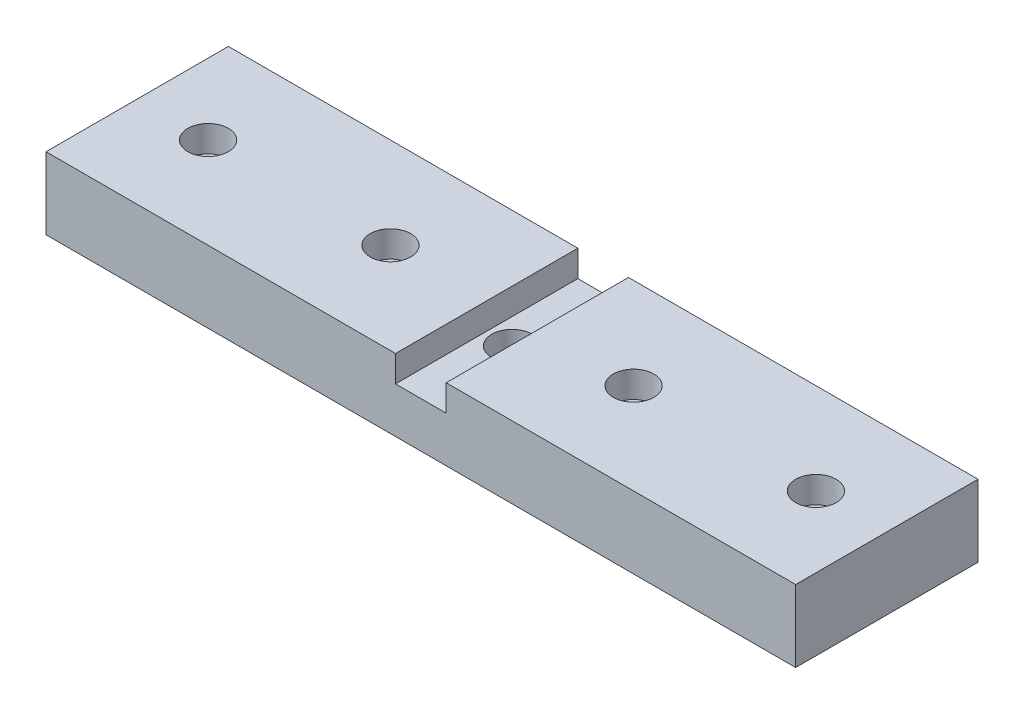
ISO-10303-21;
HEADER;
FILE_DESCRIPTION(('STEP AP214'),'2;1');
FILE_NAME('part.step','',(''),(''),'','','');
FILE_SCHEMA(('AUTOMOTIVE_DESIGN { 1 0 10303 214 1 1 1 1 }'));
ENDSEC;
DATA;
#1=APPLICATION_CONTEXT('core data for automotive mechanical design processes');
#2=APPLICATION_PROTOCOL_DEFINITION('international standard','automotive_design',2000,#1);
#3=PRODUCT_CONTEXT('',#1,'mechanical');
#4=PRODUCT('Part','Part','',(#3));
#5=PRODUCT_RELATED_PRODUCT_CATEGORY('part','',(#4));
#6=PRODUCT_DEFINITION_FORMATION('','',#4);
#7=PRODUCT_DEFINITION_CONTEXT('part definition',#1,'design');
#8=PRODUCT_DEFINITION('design','',#6,#7);
#9=PRODUCT_DEFINITION_SHAPE('','',#8);
#10=(LENGTH_UNIT() NAMED_UNIT(*) SI_UNIT(.MILLI.,.METRE.));
#11=(NAMED_UNIT(*) PLANE_ANGLE_UNIT() SI_UNIT($,.RADIAN.));
#12=(NAMED_UNIT(*) SI_UNIT($,.STERADIAN.) SOLID_ANGLE_UNIT());
#13=UNCERTAINTY_MEASURE_WITH_UNIT(LENGTH_MEASURE(1.E-05),#10,'distance_accuracy_value','');
#14=(GEOMETRIC_REPRESENTATION_CONTEXT(3) GLOBAL_UNCERTAINTY_ASSIGNED_CONTEXT((#13)) GLOBAL_UNIT_ASSIGNED_CONTEXT((#10,
#11,#12)) REPRESENTATION_CONTEXT('',''));
#15=CARTESIAN_POINT('',(0.,0.,0.));
#16=DIRECTION('',(0.,0.,1.));
#17=DIRECTION('',(1.,0.,0.));
#18=AXIS2_PLACEMENT_3D('',#15,#16,#17);
#19=CARTESIAN_POINT('',(150.,35.5,0.));
#20=DIRECTION('',(0.,1.,0.));
#21=DIRECTION('',(0.,0.,1.));
#22=AXIS2_PLACEMENT_3D('',#19,#20,#21);
#23=CYLINDRICAL_SURFACE('',#22,6.74999999999999);
#24=CARTESIAN_POINT('',(150.,0.,0.));
#25=DIRECTION('',(0.,1.,0.));
#26=DIRECTION('',(0.,0.,1.));
#27=AXIS2_PLACEMENT_3D('',#24,#25,#26);
#28=CIRCLE('',#27,6.74999999999998);
#29=CARTESIAN_POINT('',(150.,0.,6.74999999999993));
#30=VERTEX_POINT('',#29);
#31=EDGE_CURVE('E11',#30,#30,#28,.T.);
#32=ORIENTED_EDGE('',*,*,#31,.F.);
#33=EDGE_LOOP('',(#32));
#34=FACE_BOUND('',#33,.T.);
#35=CARTESIAN_POINT('',(150.,22.5,0.));
#36=DIRECTION('',(0.,1.,0.));
#37=DIRECTION('',(0.,0.,1.));
#38=AXIS2_PLACEMENT_3D('',#35,#36,#37);
#39=CIRCLE('',#38,6.75000000000001);
#40=CARTESIAN_POINT('',(150.,22.5,6.74999999999996));
#41=VERTEX_POINT('',#40);
#42=EDGE_CURVE('E42',#41,#41,#39,.T.);
#43=ORIENTED_EDGE('',*,*,#42,.T.);
#44=EDGE_LOOP('',(#43));
#45=FACE_BOUND('',#44,.T.);
#46=ADVANCED_FACE('F35',(#34,#45),#23,.F.);
#47=CARTESIAN_POINT('',(156.75,22.5,0.));
#48=DIRECTION('',(0.,-1.,0.));
#49=DIRECTION('',(0.,0.,-1.));
#50=AXIS2_PLACEMENT_3D('',#47,#48,#49);
#51=PLANE('',#50);
#52=ORIENTED_EDGE('',*,*,#42,.F.);
#53=EDGE_LOOP('',(#52));
#54=FACE_BOUND('',#53,.T.);
#55=CARTESIAN_POINT('',(150.,22.5,0.));
#56=DIRECTION('',(0.,1.,0.));
#57=DIRECTION('',(0.,0.,1.));
#58=AXIS2_PLACEMENT_3D('',#55,#56,#57);
#59=CIRCLE('',#58,9.99999999999998);
#60=CARTESIAN_POINT('',(150.,22.5,9.99999999999994));
#61=VERTEX_POINT('',#60);
#62=EDGE_CURVE('E171',#61,#61,#59,.T.);
#63=ORIENTED_EDGE('',*,*,#62,.T.);
#64=EDGE_LOOP('',(#63));
#65=FACE_BOUND('',#64,.T.);
#66=ADVANCED_FACE('F180',(#54,#65),#51,.F.);
#67=CARTESIAN_POINT('',(150.,35.5,0.));
#68=DIRECTION('',(0.,1.,0.));
#69=DIRECTION('',(0.,0.,1.));
#70=AXIS2_PLACEMENT_3D('',#67,#68,#69);
#71=CYLINDRICAL_SURFACE('',#70,9.99999999999999);
#72=ORIENTED_EDGE('',*,*,#62,.F.);
#73=EDGE_LOOP('',(#72));
#74=FACE_BOUND('',#73,.T.);
#75=CARTESIAN_POINT('',(150.,35.5,0.));
#76=DIRECTION('',(0.,1.,0.));
#77=DIRECTION('',(0.,0.,1.));
#78=AXIS2_PLACEMENT_3D('',#75,#76,#77);
#79=CIRCLE('',#78,10.);
#80=CARTESIAN_POINT('',(150.,35.5,9.99999999999996));
#81=VERTEX_POINT('',#80);
#82=EDGE_CURVE('E174',#81,#81,#79,.T.);
#83=ORIENTED_EDGE('',*,*,#82,.T.);
#84=EDGE_LOOP('',(#83));
#85=FACE_BOUND('',#84,.T.);
#86=ADVANCED_FACE('F183',(#74,#85),#71,.F.);
#87=CARTESIAN_POINT('',(60.,35.5,0.));
#88=DIRECTION('',(0.,1.,0.));
#89=DIRECTION('',(0.,0.,1.));
#90=AXIS2_PLACEMENT_3D('',#87,#88,#89);
#91=CYLINDRICAL_SURFACE('',#90,6.74999999999999);
#92=CARTESIAN_POINT('',(60.,0.,0.));
#93=DIRECTION('',(0.,1.,0.));
#94=DIRECTION('',(0.,0.,1.));
#95=AXIS2_PLACEMENT_3D('',#92,#93,#94);
#96=CIRCLE('',#95,6.74999999999998);
#97=CARTESIAN_POINT('',(60.,0.,6.74999999999994));
#98=VERTEX_POINT('',#97);
#99=EDGE_CURVE('E168',#98,#98,#96,.T.);
#100=ORIENTED_EDGE('',*,*,#99,.F.);
#101=EDGE_LOOP('',(#100));
#102=FACE_BOUND('',#101,.T.);
#103=CARTESIAN_POINT('',(60.,22.5,0.));
#104=DIRECTION('',(0.,1.,0.));
#105=DIRECTION('',(0.,0.,1.));
#106=AXIS2_PLACEMENT_3D('',#103,#104,#105);
#107=CIRCLE('',#106,6.75000000000001);
#108=CARTESIAN_POINT('',(60.,22.5,6.74999999999997));
#109=VERTEX_POINT('',#108);
#110=EDGE_CURVE('E165',#109,#109,#107,.T.);
#111=ORIENTED_EDGE('',*,*,#110,.T.);
#112=EDGE_LOOP('',(#111));
#113=FACE_BOUND('',#112,.T.);
#114=ADVANCED_FACE('F188',(#102,#113),#91,.F.);
#115=CARTESIAN_POINT('',(66.75,22.5,0.));
#116=DIRECTION('',(0.,-1.,0.));
#117=DIRECTION('',(0.,0.,-1.));
#118=AXIS2_PLACEMENT_3D('',#115,#116,#117);
#119=PLANE('',#118);
#120=ORIENTED_EDGE('',*,*,#110,.F.);
#121=EDGE_LOOP('',(#120));
#122=FACE_BOUND('',#121,.T.);
#123=CARTESIAN_POINT('',(60.,22.5,0.));
#124=DIRECTION('',(0.,1.,0.));
#125=DIRECTION('',(0.,0.,1.));
#126=AXIS2_PLACEMENT_3D('',#123,#124,#125);
#127=CIRCLE('',#126,9.99999999999998);
#128=CARTESIAN_POINT('',(60.,22.5,9.99999999999995));
#129=VERTEX_POINT('',#128);
#130=EDGE_CURVE('E159',#129,#129,#127,.T.);
#131=ORIENTED_EDGE('',*,*,#130,.T.);
#132=EDGE_LOOP('',(#131));
#133=FACE_BOUND('',#132,.T.);
#134=ADVANCED_FACE('F308',(#122,#133),#119,.F.);
#135=CARTESIAN_POINT('',(60.,35.5,0.));
#136=DIRECTION('',(0.,1.,0.));
#137=DIRECTION('',(0.,0.,1.));
#138=AXIS2_PLACEMENT_3D('',#135,#136,#137);
#139=CYLINDRICAL_SURFACE('',#138,9.99999999999999);
#140=ORIENTED_EDGE('',*,*,#130,.F.);
#141=EDGE_LOOP('',(#140));
#142=FACE_BOUND('',#141,.T.);
#143=CARTESIAN_POINT('',(60.,35.5,0.));
#144=DIRECTION('',(0.,1.,0.));
#145=DIRECTION('',(0.,0.,1.));
#146=AXIS2_PLACEMENT_3D('',#143,#144,#145);
#147=CIRCLE('',#146,10.);
#148=CARTESIAN_POINT('',(60.,35.5,9.99999999999998));
#149=VERTEX_POINT('',#148);
#150=EDGE_CURVE('E162',#149,#149,#147,.T.);
#151=ORIENTED_EDGE('',*,*,#150,.T.);
#152=EDGE_LOOP('',(#151));
#153=FACE_BOUND('',#152,.T.);
#154=ADVANCED_FACE('F196',(#142,#153),#139,.F.);
#155=CARTESIAN_POINT('',(0.,35.5,0.));
#156=DIRECTION('',(0.,1.,0.));
#157=DIRECTION('',(0.,0.,1.));
#158=AXIS2_PLACEMENT_3D('',#155,#156,#157);
#159=PLANE('',#158);
#160=ORIENTED_EDGE('',*,*,#82,.F.);
#161=EDGE_LOOP('',(#160));
#162=FACE_BOUND('',#161,.T.);
#163=ORIENTED_EDGE('',*,*,#150,.F.);
#164=EDGE_LOOP('',(#163));
#165=FACE_BOUND('',#164,.T.);
#166=DIRECTION('',(0.,0.,-1.));
#167=VECTOR('',#166,1.);
#168=CARTESIAN_POINT('',(12.5,35.5,45.));
#169=LINE('',#168,#167);
#170=CARTESIAN_POINT('',(12.5,35.5,45.));
#171=VERTEX_POINT('',#170);
#172=CARTESIAN_POINT('',(12.5,35.5,-45.));
#173=VERTEX_POINT('',#172);
#174=EDGE_CURVE('E123',#171,#173,#169,.T.);
#175=ORIENTED_EDGE('',*,*,#174,.F.);
#176=DIRECTION('',(1.,0.,0.));
#177=VECTOR('',#176,1.);
#178=CARTESIAN_POINT('',(185.,35.5,45.));
#179=LINE('',#178,#177);
#180=CARTESIAN_POINT('',(185.,35.5,45.));
#181=VERTEX_POINT('',#180);
#182=EDGE_CURVE('E134',#171,#181,#179,.T.);
#183=ORIENTED_EDGE('',*,*,#182,.T.);
#184=DIRECTION('',(0.,0.,-1.));
#185=VECTOR('',#184,1.);
#186=CARTESIAN_POINT('',(185.,35.5,45.));
#187=LINE('',#186,#185);
#188=CARTESIAN_POINT('',(185.,35.5,-45.));
#189=VERTEX_POINT('',#188);
#190=EDGE_CURVE('E136',#181,#189,#187,.T.);
#191=ORIENTED_EDGE('',*,*,#190,.T.);
#192=DIRECTION('',(-1.,0.,0.));
#193=VECTOR('',#192,1.);
#194=CARTESIAN_POINT('',(185.,35.5,-45.));
#195=LINE('',#194,#193);
#196=EDGE_CURVE('E138',#189,#173,#195,.T.);
#197=ORIENTED_EDGE('',*,*,#196,.T.);
#198=EDGE_LOOP('',(#175,#183,#191,#197));
#199=FACE_BOUND('',#198,.T.);
#200=ADVANCED_FACE('F192',(#162,#165,#199),#159,.T.);
#201=CARTESIAN_POINT('',(-185.,35.5,45.));
#202=DIRECTION('',(1.,0.,0.));
#203=DIRECTION('',(0.,0.,-1.));
#204=AXIS2_PLACEMENT_3D('',#201,#202,#203);
#205=PLANE('',#204);
#206=DIRECTION('',(0.,0.,1.));
#207=VECTOR('',#206,1.);
#208=CARTESIAN_POINT('',(-185.,0.,45.));
#209=LINE('',#208,#207);
#210=CARTESIAN_POINT('',(-185.,0.,-45.));
#211=VERTEX_POINT('',#210);
#212=CARTESIAN_POINT('',(-185.,0.,45.));
#213=VERTEX_POINT('',#212);
#214=EDGE_CURVE('E142',#211,#213,#209,.T.);
#215=ORIENTED_EDGE('',*,*,#214,.T.);
#216=DIRECTION('',(0.,-1.,0.));
#217=VECTOR('',#216,1.);
#218=CARTESIAN_POINT('',(-185.,35.5,45.));
#219=LINE('',#218,#217);
#220=CARTESIAN_POINT('',(-185.,35.5,45.));
#221=VERTEX_POINT('',#220);
#222=EDGE_CURVE('E157',#221,#213,#219,.T.);
#223=ORIENTED_EDGE('',*,*,#222,.F.);
#224=DIRECTION('',(0.,0.,1.));
#225=VECTOR('',#224,1.);
#226=CARTESIAN_POINT('',(-185.,35.5,45.));
#227=LINE('',#226,#225);
#228=CARTESIAN_POINT('',(-185.,35.5,-45.));
#229=VERTEX_POINT('',#228);
#230=EDGE_CURVE('E132',#229,#221,#227,.T.);
#231=ORIENTED_EDGE('',*,*,#230,.F.);
#232=DIRECTION('',(0.,-1.,0.));
#233=VECTOR('',#232,1.);
#234=CARTESIAN_POINT('',(-185.,35.5,-45.));
#235=LINE('',#234,#233);
#236=EDGE_CURVE('E141',#229,#211,#235,.T.);
#237=ORIENTED_EDGE('',*,*,#236,.T.);
#238=EDGE_LOOP('',(#215,#223,#231,#237));
#239=FACE_BOUND('',#238,.T.);
#240=ADVANCED_FACE('F195',(#239),#205,.F.);
#241=CARTESIAN_POINT('',(185.,35.5,45.));
#242=DIRECTION('',(0.,0.,-1.));
#243=DIRECTION('',(-1.,0.,0.));
#244=AXIS2_PLACEMENT_3D('',#241,#242,#243);
#245=PLANE('',#244);
#246=ORIENTED_EDGE('',*,*,#182,.F.);
#247=DIRECTION('',(0.,1.,0.));
#248=VECTOR('',#247,1.);
#249=CARTESIAN_POINT('',(12.5,22.5,45.));
#250=LINE('',#249,#248);
#251=CARTESIAN_POINT('',(12.5,22.5,45.));
#252=VERTEX_POINT('',#251);
#253=EDGE_CURVE('E127',#252,#171,#250,.T.);
#254=ORIENTED_EDGE('',*,*,#253,.F.);
#255=DIRECTION('',(1.,0.,0.));
#256=VECTOR('',#255,1.);
#257=CARTESIAN_POINT('',(12.5,22.5,45.));
#258=LINE('',#257,#256);
#259=CARTESIAN_POINT('',(-12.5,22.5,45.));
#260=VERTEX_POINT('',#259);
#261=EDGE_CURVE('E114',#260,#252,#258,.T.);
#262=ORIENTED_EDGE('',*,*,#261,.F.);
#263=DIRECTION('',(0.,1.,0.));
#264=VECTOR('',#263,1.);
#265=CARTESIAN_POINT('',(-12.5,22.5,45.));
#266=LINE('',#265,#264);
#267=CARTESIAN_POINT('',(-12.5,35.5,45.));
#268=VERTEX_POINT('',#267);
#269=EDGE_CURVE('E111',#260,#268,#266,.T.);
#270=ORIENTED_EDGE('',*,*,#269,.T.);
#271=EDGE_CURVE('E87',#221,#268,#179,.T.);
#272=ORIENTED_EDGE('',*,*,#271,.F.);
#273=ORIENTED_EDGE('',*,*,#222,.T.);
#274=DIRECTION('',(1.,0.,0.));
#275=VECTOR('',#274,1.);
#276=CARTESIAN_POINT('',(185.,0.,45.));
#277=LINE('',#276,#275);
#278=CARTESIAN_POINT('',(185.,0.,45.));
#279=VERTEX_POINT('',#278);
#280=EDGE_CURVE('E145',#213,#279,#277,.T.);
#281=ORIENTED_EDGE('',*,*,#280,.T.);
#282=DIRECTION('',(0.,-1.,0.));
#283=VECTOR('',#282,1.);
#284=CARTESIAN_POINT('',(185.,35.5,45.));
#285=LINE('',#284,#283);
#286=EDGE_CURVE('E154',#181,#279,#285,.T.);
#287=ORIENTED_EDGE('',*,*,#286,.F.);
#288=EDGE_LOOP('',(#246,#254,#262,#270,#272,#273,#281,#287));
#289=FACE_BOUND('',#288,.T.);
#290=ADVANCED_FACE('F209',(#289),#245,.F.);
#291=CARTESIAN_POINT('',(185.,35.5,45.));
#292=DIRECTION('',(-1.,0.,0.));
#293=DIRECTION('',(0.,0.,1.));
#294=AXIS2_PLACEMENT_3D('',#291,#292,#293);
#295=PLANE('',#294);
#296=DIRECTION('',(0.,0.,-1.));
#297=VECTOR('',#296,1.);
#298=CARTESIAN_POINT('',(185.,0.,45.));
#299=LINE('',#298,#297);
#300=CARTESIAN_POINT('',(185.,0.,-45.));
#301=VERTEX_POINT('',#300);
#302=EDGE_CURVE('E148',#279,#301,#299,.T.);
#303=ORIENTED_EDGE('',*,*,#302,.T.);
#304=DIRECTION('',(0.,-1.,0.));
#305=VECTOR('',#304,1.);
#306=CARTESIAN_POINT('',(185.,35.5,-45.));
#307=LINE('',#306,#305);
#308=EDGE_CURVE('E152',#189,#301,#307,.T.);
#309=ORIENTED_EDGE('',*,*,#308,.F.);
#310=ORIENTED_EDGE('',*,*,#190,.F.);
#311=ORIENTED_EDGE('',*,*,#286,.T.);
#312=EDGE_LOOP('',(#303,#309,#310,#311));
#313=FACE_BOUND('',#312,.T.);
#314=ADVANCED_FACE('F214',(#313),#295,.F.);
#315=CARTESIAN_POINT('',(185.,35.5,-45.));
#316=DIRECTION('',(0.,0.,1.));
#317=DIRECTION('',(1.,0.,0.));
#318=AXIS2_PLACEMENT_3D('',#315,#316,#317);
#319=PLANE('',#318);
#320=DIRECTION('',(-1.,0.,0.));
#321=VECTOR('',#320,1.);
#322=CARTESIAN_POINT('',(-12.5,22.5,-45.));
#323=LINE('',#322,#321);
#324=CARTESIAN_POINT('',(12.5,22.5,-45.));
#325=VERTEX_POINT('',#324);
#326=CARTESIAN_POINT('',(-12.5,22.5,-45.));
#327=VERTEX_POINT('',#326);
#328=EDGE_CURVE('E115',#325,#327,#323,.T.);
#329=ORIENTED_EDGE('',*,*,#328,.F.);
#330=DIRECTION('',(0.,1.,0.));
#331=VECTOR('',#330,1.);
#332=CARTESIAN_POINT('',(12.5,22.5,-45.));
#333=LINE('',#332,#331);
#334=EDGE_CURVE('E146',#325,#173,#333,.T.);
#335=ORIENTED_EDGE('',*,*,#334,.T.);
#336=ORIENTED_EDGE('',*,*,#196,.F.);
#337=ORIENTED_EDGE('',*,*,#308,.T.);
#338=DIRECTION('',(-1.,0.,0.));
#339=VECTOR('',#338,1.);
#340=CARTESIAN_POINT('',(185.,0.,-45.));
#341=LINE('',#340,#339);
#342=EDGE_CURVE('E79',#301,#211,#341,.T.);
#343=ORIENTED_EDGE('',*,*,#342,.T.);
#344=ORIENTED_EDGE('',*,*,#236,.F.);
#345=CARTESIAN_POINT('',(-12.5,35.5,-45.));
#346=VERTEX_POINT('',#345);
#347=EDGE_CURVE('E57',#346,#229,#195,.T.);
#348=ORIENTED_EDGE('',*,*,#347,.F.);
#349=DIRECTION('',(0.,1.,0.));
#350=VECTOR('',#349,1.);
#351=CARTESIAN_POINT('',(-12.5,22.5,-45.));
#352=LINE('',#351,#350);
#353=EDGE_CURVE('E49',#327,#346,#352,.T.);
#354=ORIENTED_EDGE('',*,*,#353,.F.);
#355=EDGE_LOOP('',(#329,#335,#336,#337,#343,#344,#348,#354));
#356=FACE_BOUND('',#355,.T.);
#357=ADVANCED_FACE('F125',(#356),#319,.F.);
#358=CARTESIAN_POINT('',(-60.,35.5,0.));
#359=DIRECTION('',(0.,1.,0.));
#360=DIRECTION('',(0.,0.,1.));
#361=AXIS2_PLACEMENT_3D('',#358,#359,#360);
#362=CIRCLE('',#361,10.);
#363=CARTESIAN_POINT('',(-60.,35.5,9.99999999999999));
#364=VERTEX_POINT('',#363);
#365=EDGE_CURVE('E240',#364,#364,#362,.T.);
#366=ORIENTED_EDGE('',*,*,#365,.F.);
#367=EDGE_LOOP('',(#366));
#368=FACE_BOUND('',#367,.T.);
#369=CARTESIAN_POINT('',(-150.,35.5,0.));
#370=DIRECTION('',(0.,1.,0.));
#371=DIRECTION('',(0.,0.,1.));
#372=AXIS2_PLACEMENT_3D('',#369,#370,#371);
#373=CIRCLE('',#372,10.);
#374=CARTESIAN_POINT('',(-150.,35.5,10.));
#375=VERTEX_POINT('',#374);
#376=EDGE_CURVE('E228',#375,#375,#373,.T.);
#377=ORIENTED_EDGE('',*,*,#376,.F.);
#378=EDGE_LOOP('',(#377));
#379=FACE_BOUND('',#378,.T.);
#380=DIRECTION('',(0.,0.,1.));
#381=VECTOR('',#380,1.);
#382=CARTESIAN_POINT('',(-12.5,35.5,-45.));
#383=LINE('',#382,#381);
#384=EDGE_CURVE('E206',#346,#268,#383,.T.);
#385=ORIENTED_EDGE('',*,*,#384,.F.);
#386=ORIENTED_EDGE('',*,*,#347,.T.);
#387=ORIENTED_EDGE('',*,*,#230,.T.);
#388=ORIENTED_EDGE('',*,*,#271,.T.);
#389=EDGE_LOOP('',(#385,#386,#387,#388));
#390=FACE_BOUND('',#389,.T.);
#391=ADVANCED_FACE('F198',(#368,#379,#390),#159,.T.);
#392=CARTESIAN_POINT('',(0.,0.,0.));
#393=DIRECTION('',(0.,1.,0.));
#394=DIRECTION('',(0.,0.,1.));
#395=AXIS2_PLACEMENT_3D('',#392,#393,#394);
#396=PLANE('',#395);
#397=CARTESIAN_POINT('',(0.,0.,0.));
#398=DIRECTION('',(0.,1.,0.));
#399=DIRECTION('',(0.,0.,1.));
#400=AXIS2_PLACEMENT_3D('',#397,#398,#399);
#401=CIRCLE('',#400,6.74999999999999);
#402=CARTESIAN_POINT('',(0.,0.,6.74999999999999));
#403=VERTEX_POINT('',#402);
#404=EDGE_CURVE('E243',#403,#403,#401,.T.);
#405=ORIENTED_EDGE('',*,*,#404,.T.);
#406=EDGE_LOOP('',(#405));
#407=FACE_BOUND('',#406,.T.);
#408=ORIENTED_EDGE('',*,*,#31,.T.);
#409=EDGE_LOOP('',(#408));
#410=FACE_BOUND('',#409,.T.);
#411=ORIENTED_EDGE('',*,*,#99,.T.);
#412=EDGE_LOOP('',(#411));
#413=FACE_BOUND('',#412,.T.);
#414=CARTESIAN_POINT('',(-60.,0.,0.));
#415=DIRECTION('',(0.,1.,0.));
#416=DIRECTION('',(0.,0.,1.));
#417=AXIS2_PLACEMENT_3D('',#414,#415,#416);
#418=CIRCLE('',#417,6.74999999999998);
#419=CARTESIAN_POINT('',(-60.,0.,6.74999999999996));
#420=VERTEX_POINT('',#419);
#421=EDGE_CURVE('E237',#420,#420,#418,.T.);
#422=ORIENTED_EDGE('',*,*,#421,.T.);
#423=EDGE_LOOP('',(#422));
#424=FACE_BOUND('',#423,.T.);
#425=CARTESIAN_POINT('',(-150.,0.,0.));
#426=DIRECTION('',(0.,1.,0.));
#427=DIRECTION('',(0.,0.,1.));
#428=AXIS2_PLACEMENT_3D('',#425,#426,#427);
#429=CIRCLE('',#428,6.74999999999998);
#430=CARTESIAN_POINT('',(-150.,0.,6.74999999999998));
#431=VERTEX_POINT('',#430);
#432=EDGE_CURVE('E217',#431,#431,#429,.T.);
#433=ORIENTED_EDGE('',*,*,#432,.T.);
#434=EDGE_LOOP('',(#433));
#435=FACE_BOUND('',#434,.T.);
#436=ORIENTED_EDGE('',*,*,#214,.F.);
#437=ORIENTED_EDGE('',*,*,#342,.F.);
#438=ORIENTED_EDGE('',*,*,#302,.F.);
#439=ORIENTED_EDGE('',*,*,#280,.F.);
#440=EDGE_LOOP('',(#436,#437,#438,#439));
#441=FACE_BOUND('',#440,.T.);
#442=ADVANCED_FACE('F277',(#407,#410,#413,#424,#435,#441),#396,.F.);
#443=CARTESIAN_POINT('',(12.5,22.5,45.));
#444=DIRECTION('',(1.,0.,0.));
#445=DIRECTION('',(0.,0.,-1.));
#446=AXIS2_PLACEMENT_3D('',#443,#444,#445);
#447=PLANE('',#446);
#448=ORIENTED_EDGE('',*,*,#174,.T.);
#449=ORIENTED_EDGE('',*,*,#334,.F.);
#450=DIRECTION('',(0.,0.,-1.));
#451=VECTOR('',#450,1.);
#452=CARTESIAN_POINT('',(12.5,22.5,45.));
#453=LINE('',#452,#451);
#454=EDGE_CURVE('E121',#252,#325,#453,.T.);
#455=ORIENTED_EDGE('',*,*,#454,.F.);
#456=ORIENTED_EDGE('',*,*,#253,.T.);
#457=EDGE_LOOP('',(#448,#449,#455,#456));
#458=FACE_BOUND('',#457,.T.);
#459=ADVANCED_FACE('F268',(#458),#447,.F.);
#460=CARTESIAN_POINT('',(-12.5,22.5,-45.));
#461=DIRECTION('',(-1.,0.,0.));
#462=DIRECTION('',(0.,0.,1.));
#463=AXIS2_PLACEMENT_3D('',#460,#461,#462);
#464=PLANE('',#463);
#465=ORIENTED_EDGE('',*,*,#384,.T.);
#466=ORIENTED_EDGE('',*,*,#269,.F.);
#467=DIRECTION('',(0.,0.,1.));
#468=VECTOR('',#467,1.);
#469=CARTESIAN_POINT('',(-12.5,22.5,-45.));
#470=LINE('',#469,#468);
#471=EDGE_CURVE('E108',#327,#260,#470,.T.);
#472=ORIENTED_EDGE('',*,*,#471,.F.);
#473=ORIENTED_EDGE('',*,*,#353,.T.);
#474=EDGE_LOOP('',(#465,#466,#472,#473));
#475=FACE_BOUND('',#474,.T.);
#476=ADVANCED_FACE('F110',(#475),#464,.F.);
#477=CARTESIAN_POINT('',(0.,22.5,0.));
#478=DIRECTION('',(0.,1.,0.));
#479=DIRECTION('',(0.,0.,1.));
#480=AXIS2_PLACEMENT_3D('',#477,#478,#479);
#481=PLANE('',#480);
#482=CARTESIAN_POINT('',(0.,22.5,0.));
#483=DIRECTION('',(0.,1.,0.));
#484=DIRECTION('',(0.,0.,1.));
#485=AXIS2_PLACEMENT_3D('',#482,#483,#484);
#486=CIRCLE('',#485,10.);
#487=CARTESIAN_POINT('',(0.,22.5,10.));
#488=VERTEX_POINT('',#487);
#489=EDGE_CURVE('E252',#488,#488,#486,.T.);
#490=ORIENTED_EDGE('',*,*,#489,.F.);
#491=EDGE_LOOP('',(#490));
#492=FACE_BOUND('',#491,.T.);
#493=ORIENTED_EDGE('',*,*,#328,.T.);
#494=ORIENTED_EDGE('',*,*,#471,.T.);
#495=ORIENTED_EDGE('',*,*,#261,.T.);
#496=ORIENTED_EDGE('',*,*,#454,.T.);
#497=EDGE_LOOP('',(#493,#494,#495,#496));
#498=FACE_BOUND('',#497,.T.);
#499=ADVANCED_FACE('F119',(#492,#498),#481,.T.);
#500=CARTESIAN_POINT('',(-150.,35.5,0.));
#501=DIRECTION('',(0.,1.,0.));
#502=DIRECTION('',(0.,0.,1.));
#503=AXIS2_PLACEMENT_3D('',#500,#501,#502);
#504=CYLINDRICAL_SURFACE('',#503,6.74999999999999);
#505=ORIENTED_EDGE('',*,*,#432,.F.);
#506=EDGE_LOOP('',(#505));
#507=FACE_BOUND('',#506,.T.);
#508=CARTESIAN_POINT('',(-150.,22.5,0.));
#509=DIRECTION('',(0.,1.,0.));
#510=DIRECTION('',(0.,0.,1.));
#511=AXIS2_PLACEMENT_3D('',#508,#509,#510);
#512=CIRCLE('',#511,6.75000000000001);
#513=CARTESIAN_POINT('',(-150.,22.5,6.75000000000001));
#514=VERTEX_POINT('',#513);
#515=EDGE_CURVE('E222',#514,#514,#512,.T.);
#516=ORIENTED_EDGE('',*,*,#515,.T.);
#517=EDGE_LOOP('',(#516));
#518=FACE_BOUND('',#517,.T.);
#519=ADVANCED_FACE('F259',(#507,#518),#504,.F.);
#520=CARTESIAN_POINT('',(-143.25,22.5,0.));
#521=DIRECTION('',(0.,-1.,0.));
#522=DIRECTION('',(0.,0.,-1.));
#523=AXIS2_PLACEMENT_3D('',#520,#521,#522);
#524=PLANE('',#523);
#525=ORIENTED_EDGE('',*,*,#515,.F.);
#526=EDGE_LOOP('',(#525));
#527=FACE_BOUND('',#526,.T.);
#528=CARTESIAN_POINT('',(-150.,22.5,0.));
#529=DIRECTION('',(0.,1.,0.));
#530=DIRECTION('',(0.,0.,1.));
#531=AXIS2_PLACEMENT_3D('',#528,#529,#530);
#532=CIRCLE('',#531,9.99999999999998);
#533=CARTESIAN_POINT('',(-150.,22.5,9.99999999999998));
#534=VERTEX_POINT('',#533);
#535=EDGE_CURVE('E225',#534,#534,#532,.T.);
#536=ORIENTED_EDGE('',*,*,#535,.T.);
#537=EDGE_LOOP('',(#536));
#538=FACE_BOUND('',#537,.T.);
#539=ADVANCED_FACE('F265',(#527,#538),#524,.F.);
#540=CARTESIAN_POINT('',(-150.,35.5,0.));
#541=DIRECTION('',(0.,1.,0.));
#542=DIRECTION('',(0.,0.,1.));
#543=AXIS2_PLACEMENT_3D('',#540,#541,#542);
#544=CYLINDRICAL_SURFACE('',#543,9.99999999999999);
#545=ORIENTED_EDGE('',*,*,#535,.F.);
#546=EDGE_LOOP('',(#545));
#547=FACE_BOUND('',#546,.T.);
#548=ORIENTED_EDGE('',*,*,#376,.T.);
#549=EDGE_LOOP('',(#548));
#550=FACE_BOUND('',#549,.T.);
#551=ADVANCED_FACE('F416',(#547,#550),#544,.F.);
#552=CARTESIAN_POINT('',(-60.,35.5,0.));
#553=DIRECTION('',(0.,1.,0.));
#554=DIRECTION('',(0.,0.,1.));
#555=AXIS2_PLACEMENT_3D('',#552,#553,#554);
#556=CYLINDRICAL_SURFACE('',#555,6.74999999999999);
#557=ORIENTED_EDGE('',*,*,#421,.F.);
#558=EDGE_LOOP('',(#557));
#559=FACE_BOUND('',#558,.T.);
#560=CARTESIAN_POINT('',(-60.,22.5,0.));
#561=DIRECTION('',(0.,1.,0.));
#562=DIRECTION('',(0.,0.,1.));
#563=AXIS2_PLACEMENT_3D('',#560,#561,#562);
#564=CIRCLE('',#563,6.75000000000001);
#565=CARTESIAN_POINT('',(-60.,22.5,6.74999999999999));
#566=VERTEX_POINT('',#565);
#567=EDGE_CURVE('E231',#566,#566,#564,.T.);
#568=ORIENTED_EDGE('',*,*,#567,.T.);
#569=EDGE_LOOP('',(#568));
#570=FACE_BOUND('',#569,.T.);
#571=ADVANCED_FACE('F412',(#559,#570),#556,.F.);
#572=CARTESIAN_POINT('',(-53.25,22.5,0.));
#573=DIRECTION('',(0.,-1.,0.));
#574=DIRECTION('',(0.,0.,-1.));
#575=AXIS2_PLACEMENT_3D('',#572,#573,#574);
#576=PLANE('',#575);
#577=ORIENTED_EDGE('',*,*,#567,.F.);
#578=EDGE_LOOP('',(#577));
#579=FACE_BOUND('',#578,.T.);
#580=CARTESIAN_POINT('',(-60.,22.5,0.));
#581=DIRECTION('',(0.,1.,0.));
#582=DIRECTION('',(0.,0.,1.));
#583=AXIS2_PLACEMENT_3D('',#580,#581,#582);
#584=CIRCLE('',#583,9.99999999999998);
#585=CARTESIAN_POINT('',(-60.,22.5,9.99999999999997));
#586=VERTEX_POINT('',#585);
#587=EDGE_CURVE('E234',#586,#586,#584,.T.);
#588=ORIENTED_EDGE('',*,*,#587,.T.);
#589=EDGE_LOOP('',(#588));
#590=FACE_BOUND('',#589,.T.);
#591=ADVANCED_FACE('F408',(#579,#590),#576,.F.);
#592=CARTESIAN_POINT('',(-60.,35.5,0.));
#593=DIRECTION('',(0.,1.,0.));
#594=DIRECTION('',(0.,0.,1.));
#595=AXIS2_PLACEMENT_3D('',#592,#593,#594);
#596=CYLINDRICAL_SURFACE('',#595,9.99999999999999);
#597=ORIENTED_EDGE('',*,*,#587,.F.);
#598=EDGE_LOOP('',(#597));
#599=FACE_BOUND('',#598,.T.);
#600=ORIENTED_EDGE('',*,*,#365,.T.);
#601=EDGE_LOOP('',(#600));
#602=FACE_BOUND('',#601,.T.);
#603=ADVANCED_FACE('F380',(#599,#602),#596,.F.);
#604=CARTESIAN_POINT('',(0.,22.5,0.));
#605=DIRECTION('',(0.,1.,0.));
#606=DIRECTION('',(0.,0.,1.));
#607=AXIS2_PLACEMENT_3D('',#604,#605,#606);
#608=CYLINDRICAL_SURFACE('',#607,6.75);
#609=ORIENTED_EDGE('',*,*,#404,.F.);
#610=EDGE_LOOP('',(#609));
#611=FACE_BOUND('',#610,.T.);
#612=CARTESIAN_POINT('',(0.,9.5,0.));
#613=DIRECTION('',(0.,1.,0.));
#614=DIRECTION('',(0.,0.,1.));
#615=AXIS2_PLACEMENT_3D('',#612,#613,#614);
#616=CIRCLE('',#615,6.75000000000001);
#617=CARTESIAN_POINT('',(0.,9.5,6.75000000000001));
#618=VERTEX_POINT('',#617);
#619=EDGE_CURVE('E246',#618,#618,#616,.T.);
#620=ORIENTED_EDGE('',*,*,#619,.T.);
#621=EDGE_LOOP('',(#620));
#622=FACE_BOUND('',#621,.T.);
#623=ADVANCED_FACE('F374',(#611,#622),#608,.F.);
#624=CARTESIAN_POINT('',(6.75000000000001,9.5,0.));
#625=DIRECTION('',(0.,-1.,0.));
#626=DIRECTION('',(0.,0.,-1.));
#627=AXIS2_PLACEMENT_3D('',#624,#625,#626);
#628=PLANE('',#627);
#629=ORIENTED_EDGE('',*,*,#619,.F.);
#630=EDGE_LOOP('',(#629));
#631=FACE_BOUND('',#630,.T.);
#632=CARTESIAN_POINT('',(0.,9.5,0.));
#633=DIRECTION('',(0.,1.,0.));
#634=DIRECTION('',(0.,0.,1.));
#635=AXIS2_PLACEMENT_3D('',#632,#633,#634);
#636=CIRCLE('',#635,9.99999999999999);
#637=CARTESIAN_POINT('',(0.,9.5,9.99999999999999));
#638=VERTEX_POINT('',#637);
#639=EDGE_CURVE('E249',#638,#638,#636,.T.);
#640=ORIENTED_EDGE('',*,*,#639,.T.);
#641=EDGE_LOOP('',(#640));
#642=FACE_BOUND('',#641,.T.);
#643=ADVANCED_FACE('F379',(#631,#642),#628,.F.);
#644=CARTESIAN_POINT('',(0.,22.5,0.));
#645=DIRECTION('',(0.,1.,0.));
#646=DIRECTION('',(0.,0.,1.));
#647=AXIS2_PLACEMENT_3D('',#644,#645,#646);
#648=CYLINDRICAL_SURFACE('',#647,9.99999999999999);
#649=ORIENTED_EDGE('',*,*,#639,.F.);
#650=EDGE_LOOP('',(#649));
#651=FACE_BOUND('',#650,.T.);
#652=ORIENTED_EDGE('',*,*,#489,.T.);
#653=EDGE_LOOP('',(#652));
#654=FACE_BOUND('',#653,.T.);
#655=ADVANCED_FACE('F256',(#651,#654),#648,.F.);
#656=CLOSED_SHELL('',(#46,#66,#86,#114,#134,#154,#200,#240,#290,#314,#357,#391,#442,#459,#476,
#499,#519,#539,#551,#571,#591,#603,#623,#643,#655));
#657=MANIFOLD_SOLID_BREP('B2',#656);
#658=ADVANCED_BREP_SHAPE_REPRESENTATION('',(#18,#657),#14);
#659=SHAPE_DEFINITION_REPRESENTATION(#9,#658);
ENDSEC;
END-ISO-10303-21;
